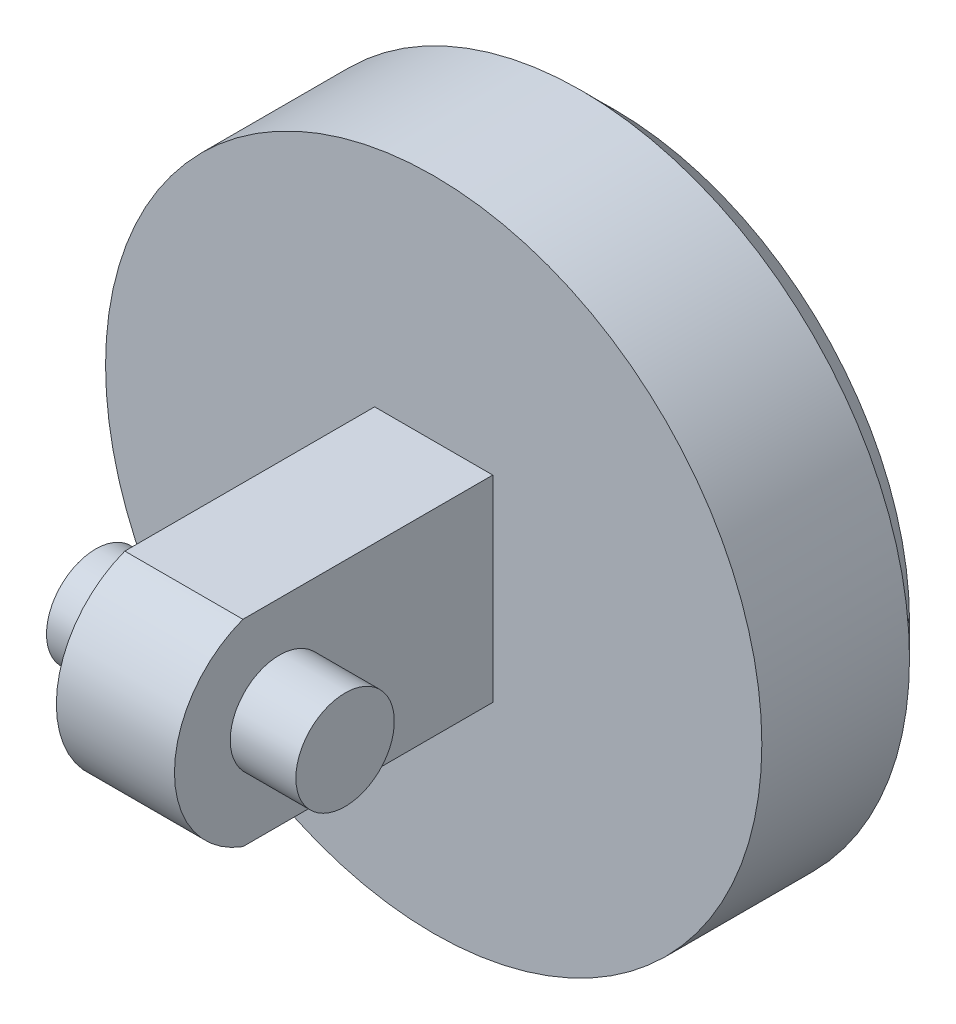
ISO-10303-21;
HEADER;
FILE_DESCRIPTION(('STEP AP214'),'2;1');
FILE_NAME('part.step','',(''),(''),'','','');
FILE_SCHEMA(('AUTOMOTIVE_DESIGN { 1 0 10303 214 1 1 1 1 }'));
ENDSEC;
DATA;
#1=APPLICATION_CONTEXT('core data for automotive mechanical design processes');
#2=APPLICATION_PROTOCOL_DEFINITION('international standard','automotive_design',2000,#1);
#3=PRODUCT_CONTEXT('',#1,'mechanical');
#4=PRODUCT('Part','Part','',(#3));
#5=PRODUCT_RELATED_PRODUCT_CATEGORY('part','',(#4));
#6=PRODUCT_DEFINITION_FORMATION('','',#4);
#7=PRODUCT_DEFINITION_CONTEXT('part definition',#1,'design');
#8=PRODUCT_DEFINITION('design','',#6,#7);
#9=PRODUCT_DEFINITION_SHAPE('','',#8);
#10=(LENGTH_UNIT() NAMED_UNIT(*) SI_UNIT(.MILLI.,.METRE.));
#11=(NAMED_UNIT(*) PLANE_ANGLE_UNIT() SI_UNIT($,.RADIAN.));
#12=(NAMED_UNIT(*) SI_UNIT($,.STERADIAN.) SOLID_ANGLE_UNIT());
#13=UNCERTAINTY_MEASURE_WITH_UNIT(LENGTH_MEASURE(1.E-05),#10,'distance_accuracy_value','');
#14=(GEOMETRIC_REPRESENTATION_CONTEXT(3) GLOBAL_UNCERTAINTY_ASSIGNED_CONTEXT((#13)) GLOBAL_UNIT_ASSIGNED_CONTEXT((#10,
#11,#12)) REPRESENTATION_CONTEXT('',''));
#15=CARTESIAN_POINT('',(0.,0.,0.));
#16=DIRECTION('',(0.,0.,1.));
#17=DIRECTION('',(1.,0.,0.));
#18=AXIS2_PLACEMENT_3D('',#15,#16,#17);
#19=CARTESIAN_POINT('',(-1.8,-3.,15.2));
#20=DIRECTION('',(1.,0.,0.));
#21=DIRECTION('',(0.,0.,-1.));
#22=AXIS2_PLACEMENT_3D('',#19,#20,#21);
#23=PLANE('',#22);
#24=DIRECTION('',(0.,0.,-1.));
#25=VECTOR('',#24,1.);
#26=CARTESIAN_POINT('',(-1.8,-3.,15.2));
#27=LINE('',#26,#25);
#28=CARTESIAN_POINT('',(-1.8,-3.,13.113552872566));
#29=VERTEX_POINT('',#28);
#30=CARTESIAN_POINT('',(-1.8,-3.,5.5));
#31=VERTEX_POINT('',#30);
#32=EDGE_CURVE('E55',#29,#31,#27,.T.);
#33=ORIENTED_EDGE('',*,*,#32,.F.);
#34=CARTESIAN_POINT('',(-1.8,0.,12.));
#35=DIRECTION('',(1.,0.,0.));
#36=DIRECTION('',(0.,0.,-1.));
#37=AXIS2_PLACEMENT_3D('',#34,#35,#36);
#38=CIRCLE('',#37,3.2);
#39=CARTESIAN_POINT('',(-1.8,3.,13.113552872566));
#40=VERTEX_POINT('',#39);
#41=EDGE_CURVE('E48',#29,#40,#38,.F.);
#42=ORIENTED_EDGE('',*,*,#41,.T.);
#43=DIRECTION('',(0.,0.,-1.));
#44=VECTOR('',#43,1.);
#45=CARTESIAN_POINT('',(-1.8,3.,15.2));
#46=LINE('',#45,#44);
#47=CARTESIAN_POINT('',(-1.8,3.,5.5));
#48=VERTEX_POINT('',#47);
#49=EDGE_CURVE('E76',#40,#48,#46,.T.);
#50=ORIENTED_EDGE('',*,*,#49,.T.);
#51=DIRECTION('',(0.,-1.,0.));
#52=VECTOR('',#51,1.);
#53=CARTESIAN_POINT('',(-1.8,-3.,5.5));
#54=LINE('',#53,#52);
#55=EDGE_CURVE('E127',#48,#31,#54,.T.);
#56=ORIENTED_EDGE('',*,*,#55,.T.);
#57=EDGE_LOOP('',(#33,#42,#50,#56));
#58=FACE_BOUND('',#57,.T.);
#59=CARTESIAN_POINT('',(-1.8,0.,12.));
#60=DIRECTION('',(1.,0.,0.));
#61=DIRECTION('',(0.,0.,-1.));
#62=AXIS2_PLACEMENT_3D('',#59,#60,#61);
#63=CIRCLE('',#62,1.5);
#64=CARTESIAN_POINT('',(-1.8,0.,10.5));
#65=VERTEX_POINT('',#64);
#66=EDGE_CURVE('E11',#65,#65,#63,.F.);
#67=ORIENTED_EDGE('',*,*,#66,.F.);
#68=EDGE_LOOP('',(#67));
#69=FACE_BOUND('',#68,.T.);
#70=ADVANCED_FACE('F33',(#58,#69),#23,.F.);
#71=CARTESIAN_POINT('',(0.,0.,5.5));
#72=DIRECTION('',(0.,0.,1.));
#73=DIRECTION('',(1.,0.,0.));
#74=AXIS2_PLACEMENT_3D('',#71,#72,#73);
#75=PLANE('',#74);
#76=CARTESIAN_POINT('',(0.,0.,5.5));
#77=DIRECTION('',(0.,0.,1.));
#78=DIRECTION('',(1.,0.,0.));
#79=AXIS2_PLACEMENT_3D('',#76,#77,#78);
#80=CIRCLE('',#79,10.);
#81=CARTESIAN_POINT('',(10.,0.,5.5));
#82=VERTEX_POINT('',#81);
#83=EDGE_CURVE('E95',#82,#82,#80,.T.);
#84=ORIENTED_EDGE('',*,*,#83,.T.);
#85=EDGE_LOOP('',(#84));
#86=FACE_BOUND('',#85,.T.);
#87=DIRECTION('',(-1.,0.,0.));
#88=VECTOR('',#87,1.);
#89=CARTESIAN_POINT('',(-1.8,3.,5.5));
#90=LINE('',#89,#88);
#91=CARTESIAN_POINT('',(1.8,3.,5.5));
#92=VERTEX_POINT('',#91);
#93=EDGE_CURVE('E91',#92,#48,#90,.T.);
#94=ORIENTED_EDGE('',*,*,#93,.F.);
#95=DIRECTION('',(0.,1.,0.));
#96=VECTOR('',#95,1.);
#97=CARTESIAN_POINT('',(1.8,-3.,5.5));
#98=LINE('',#97,#96);
#99=CARTESIAN_POINT('',(1.8,-3.,5.5));
#100=VERTEX_POINT('',#99);
#101=EDGE_CURVE('E78',#100,#92,#98,.T.);
#102=ORIENTED_EDGE('',*,*,#101,.F.);
#103=DIRECTION('',(1.,0.,0.));
#104=VECTOR('',#103,1.);
#105=CARTESIAN_POINT('',(-1.8,-3.,5.5));
#106=LINE('',#105,#104);
#107=EDGE_CURVE('E129',#31,#100,#106,.T.);
#108=ORIENTED_EDGE('',*,*,#107,.F.);
#109=ORIENTED_EDGE('',*,*,#55,.F.);
#110=EDGE_LOOP('',(#94,#102,#108,#109));
#111=FACE_BOUND('',#110,.T.);
#112=ADVANCED_FACE('F118',(#86,#111),#75,.T.);
#113=CARTESIAN_POINT('',(0.,0.,5.5));
#114=DIRECTION('',(0.,0.,-1.));
#115=DIRECTION('',(-1.,0.,0.));
#116=AXIS2_PLACEMENT_3D('',#113,#114,#115);
#117=CYLINDRICAL_SURFACE('',#116,10.);
#118=CARTESIAN_POINT('',(0.,0.,1.));
#119=DIRECTION('',(0.,0.,1.));
#120=DIRECTION('',(1.,0.,0.));
#121=AXIS2_PLACEMENT_3D('',#118,#119,#120);
#122=CIRCLE('',#121,10.);
#123=CARTESIAN_POINT('',(10.,0.,1.));
#124=VERTEX_POINT('',#123);
#125=EDGE_CURVE('E103',#124,#124,#122,.T.);
#126=ORIENTED_EDGE('',*,*,#125,.T.);
#127=EDGE_LOOP('',(#126));
#128=FACE_BOUND('',#127,.T.);
#129=ORIENTED_EDGE('',*,*,#83,.F.);
#130=EDGE_LOOP('',(#129));
#131=FACE_BOUND('',#130,.T.);
#132=ADVANCED_FACE('F115',(#128,#131),#117,.T.);
#133=CARTESIAN_POINT('',(0.,0.,0.));
#134=DIRECTION('',(0.,0.,1.));
#135=DIRECTION('',(1.,0.,0.));
#136=AXIS2_PLACEMENT_3D('',#133,#134,#135);
#137=PLANE('',#136);
#138=CARTESIAN_POINT('',(0.,0.,0.));
#139=DIRECTION('',(0.,0.,1.));
#140=DIRECTION('',(1.,0.,0.));
#141=AXIS2_PLACEMENT_3D('',#138,#139,#140);
#142=CIRCLE('',#141,8.99999999999999);
#143=CARTESIAN_POINT('',(8.99999999999999,0.,0.));
#144=VERTEX_POINT('',#143);
#145=EDGE_CURVE('E41',#144,#144,#142,.F.);
#146=ORIENTED_EDGE('',*,*,#145,.T.);
#147=EDGE_LOOP('',(#146));
#148=FACE_BOUND('',#147,.T.);
#149=ADVANCED_FACE('F108',(#148),#137,.F.);
#150=CARTESIAN_POINT('',(1.8,-3.,15.2));
#151=DIRECTION('',(-1.,0.,0.));
#152=DIRECTION('',(0.,0.,1.));
#153=AXIS2_PLACEMENT_3D('',#150,#151,#152);
#154=PLANE('',#153);
#155=CARTESIAN_POINT('',(1.8,0.,12.));
#156=DIRECTION('',(-1.,0.,0.));
#157=DIRECTION('',(0.,0.,1.));
#158=AXIS2_PLACEMENT_3D('',#155,#156,#157);
#159=CIRCLE('',#158,1.5);
#160=CARTESIAN_POINT('',(1.8,0.,13.5));
#161=VERTEX_POINT('',#160);
#162=EDGE_CURVE('E246',#161,#161,#159,.T.);
#163=ORIENTED_EDGE('',*,*,#162,.T.);
#164=EDGE_LOOP('',(#163));
#165=FACE_BOUND('',#164,.T.);
#166=CARTESIAN_POINT('',(1.8,0.,12.));
#167=DIRECTION('',(-1.,0.,0.));
#168=DIRECTION('',(0.,0.,1.));
#169=AXIS2_PLACEMENT_3D('',#166,#167,#168);
#170=CIRCLE('',#169,3.2);
#171=CARTESIAN_POINT('',(1.8,3.,13.113552872566));
#172=VERTEX_POINT('',#171);
#173=CARTESIAN_POINT('',(1.8,-3.,13.113552872566));
#174=VERTEX_POINT('',#173);
#175=EDGE_CURVE('E84',#172,#174,#170,.F.);
#176=ORIENTED_EDGE('',*,*,#175,.T.);
#177=DIRECTION('',(0.,0.,-1.));
#178=VECTOR('',#177,1.);
#179=CARTESIAN_POINT('',(1.8,-3.,15.2));
#180=LINE('',#179,#178);
#181=EDGE_CURVE('E97',#174,#100,#180,.T.);
#182=ORIENTED_EDGE('',*,*,#181,.T.);
#183=ORIENTED_EDGE('',*,*,#101,.T.);
#184=DIRECTION('',(0.,0.,-1.));
#185=VECTOR('',#184,1.);
#186=CARTESIAN_POINT('',(1.8,3.,15.2));
#187=LINE('',#186,#185);
#188=EDGE_CURVE('E93',#172,#92,#187,.T.);
#189=ORIENTED_EDGE('',*,*,#188,.F.);
#190=EDGE_LOOP('',(#176,#182,#183,#189));
#191=FACE_BOUND('',#190,.T.);
#192=ADVANCED_FACE('F136',(#165,#191),#154,.F.);
#193=CARTESIAN_POINT('',(-1.8,3.,15.2));
#194=DIRECTION('',(0.,-1.,0.));
#195=DIRECTION('',(0.,0.,-1.));
#196=AXIS2_PLACEMENT_3D('',#193,#194,#195);
#197=PLANE('',#196);
#198=ORIENTED_EDGE('',*,*,#49,.F.);
#199=DIRECTION('',(1.,0.,0.));
#200=VECTOR('',#199,1.);
#201=CARTESIAN_POINT('',(-56.687264480779,3.,13.113552872566));
#202=LINE('',#201,#200);
#203=EDGE_CURVE('E82',#40,#172,#202,.T.);
#204=ORIENTED_EDGE('',*,*,#203,.T.);
#205=ORIENTED_EDGE('',*,*,#188,.T.);
#206=ORIENTED_EDGE('',*,*,#93,.T.);
#207=EDGE_LOOP('',(#198,#204,#205,#206));
#208=FACE_BOUND('',#207,.T.);
#209=ADVANCED_FACE('F89',(#208),#197,.F.);
#210=CARTESIAN_POINT('',(-1.8,-3.,15.2));
#211=DIRECTION('',(0.,1.,0.));
#212=DIRECTION('',(0.,0.,1.));
#213=AXIS2_PLACEMENT_3D('',#210,#211,#212);
#214=PLANE('',#213);
#215=ORIENTED_EDGE('',*,*,#181,.F.);
#216=DIRECTION('',(1.,0.,0.));
#217=VECTOR('',#216,1.);
#218=CARTESIAN_POINT('',(-56.687264480779,-3.,13.113552872566));
#219=LINE('',#218,#217);
#220=EDGE_CURVE('E79',#174,#29,#219,.F.);
#221=ORIENTED_EDGE('',*,*,#220,.T.);
#222=ORIENTED_EDGE('',*,*,#32,.T.);
#223=ORIENTED_EDGE('',*,*,#107,.T.);
#224=EDGE_LOOP('',(#215,#221,#222,#223));
#225=FACE_BOUND('',#224,.T.);
#226=ADVANCED_FACE('F137',(#225),#214,.F.);
#227=CARTESIAN_POINT('',(-56.687264480779,0.,12.));
#228=DIRECTION('',(1.,0.,0.));
#229=DIRECTION('',(0.,0.,-1.));
#230=AXIS2_PLACEMENT_3D('',#227,#228,#229);
#231=CYLINDRICAL_SURFACE('',#230,3.2);
#232=ORIENTED_EDGE('',*,*,#41,.F.);
#233=ORIENTED_EDGE('',*,*,#220,.F.);
#234=ORIENTED_EDGE('',*,*,#175,.F.);
#235=ORIENTED_EDGE('',*,*,#203,.F.);
#236=EDGE_LOOP('',(#232,#233,#234,#235));
#237=FACE_BOUND('',#236,.T.);
#238=ADVANCED_FACE('F83',(#237),#231,.T.);
#239=CARTESIAN_POINT('',(0.,0.,1.));
#240=DIRECTION('',(0.,0.,1.));
#241=DIRECTION('',(1.,0.,0.));
#242=AXIS2_PLACEMENT_3D('',#239,#240,#241);
#243=CONICAL_SURFACE('',#242,10.,0.785398163397452);
#244=ORIENTED_EDGE('',*,*,#145,.F.);
#245=EDGE_LOOP('',(#244));
#246=FACE_BOUND('',#245,.T.);
#247=ORIENTED_EDGE('',*,*,#125,.F.);
#248=EDGE_LOOP('',(#247));
#249=FACE_BOUND('',#248,.T.);
#250=ADVANCED_FACE('F35',(#246,#249),#243,.T.);
#251=CARTESIAN_POINT('',(-3.8,0.,12.));
#252=DIRECTION('',(1.,0.,0.));
#253=DIRECTION('',(0.,0.,-1.));
#254=AXIS2_PLACEMENT_3D('',#251,#252,#253);
#255=CYLINDRICAL_SURFACE('',#254,1.5);
#256=CARTESIAN_POINT('',(-3.8,0.,12.));
#257=DIRECTION('',(-1.,0.,0.));
#258=DIRECTION('',(0.,0.,1.));
#259=AXIS2_PLACEMENT_3D('',#256,#257,#258);
#260=CIRCLE('',#259,1.5);
#261=CARTESIAN_POINT('',(-3.8,0.,13.5));
#262=VERTEX_POINT('',#261);
#263=EDGE_CURVE('E87',#262,#262,#260,.T.);
#264=ORIENTED_EDGE('',*,*,#263,.F.);
#265=EDGE_LOOP('',(#264));
#266=FACE_BOUND('',#265,.T.);
#267=ORIENTED_EDGE('',*,*,#66,.T.);
#268=EDGE_LOOP('',(#267));
#269=FACE_BOUND('',#268,.T.);
#270=ADVANCED_FACE('F112',(#266,#269),#255,.T.);
#271=CARTESIAN_POINT('',(-3.8,0.,12.));
#272=DIRECTION('',(-1.,0.,0.));
#273=DIRECTION('',(0.,0.,1.));
#274=AXIS2_PLACEMENT_3D('',#271,#272,#273);
#275=PLANE('',#274);
#276=ORIENTED_EDGE('',*,*,#263,.T.);
#277=EDGE_LOOP('',(#276));
#278=FACE_BOUND('',#277,.T.);
#279=ADVANCED_FACE('F204',(#278),#275,.T.);
#280=CARTESIAN_POINT('',(3.8,0.,12.));
#281=DIRECTION('',(-1.,0.,0.));
#282=DIRECTION('',(0.,0.,1.));
#283=AXIS2_PLACEMENT_3D('',#280,#281,#282);
#284=CYLINDRICAL_SURFACE('',#283,1.5);
#285=CARTESIAN_POINT('',(3.8,0.,12.));
#286=DIRECTION('',(-1.,0.,0.));
#287=DIRECTION('',(0.,0.,1.));
#288=AXIS2_PLACEMENT_3D('',#285,#286,#287);
#289=CIRCLE('',#288,1.5);
#290=CARTESIAN_POINT('',(3.8,0.,13.5));
#291=VERTEX_POINT('',#290);
#292=EDGE_CURVE('E245',#291,#291,#289,.T.);
#293=ORIENTED_EDGE('',*,*,#292,.T.);
#294=EDGE_LOOP('',(#293));
#295=FACE_BOUND('',#294,.T.);
#296=ORIENTED_EDGE('',*,*,#162,.F.);
#297=EDGE_LOOP('',(#296));
#298=FACE_BOUND('',#297,.T.);
#299=ADVANCED_FACE('F211',(#295,#298),#284,.T.);
#300=CARTESIAN_POINT('',(3.8,0.,12.));
#301=DIRECTION('',(1.,0.,0.));
#302=DIRECTION('',(0.,0.,1.));
#303=AXIS2_PLACEMENT_3D('',#300,#301,#302);
#304=PLANE('',#303);
#305=ORIENTED_EDGE('',*,*,#292,.F.);
#306=EDGE_LOOP('',(#305));
#307=FACE_BOUND('',#306,.T.);
#308=ADVANCED_FACE('F218',(#307),#304,.T.);
#309=CLOSED_SHELL('',(#70,#112,#132,#149,#192,#209,#226,#238,#250,#270,#279,#299,#308));
#310=MANIFOLD_SOLID_BREP('B2',#309);
#311=ADVANCED_BREP_SHAPE_REPRESENTATION('',(#18,#310),#14);
#312=SHAPE_DEFINITION_REPRESENTATION(#9,#311);
ENDSEC;
END-ISO-10303-21;
